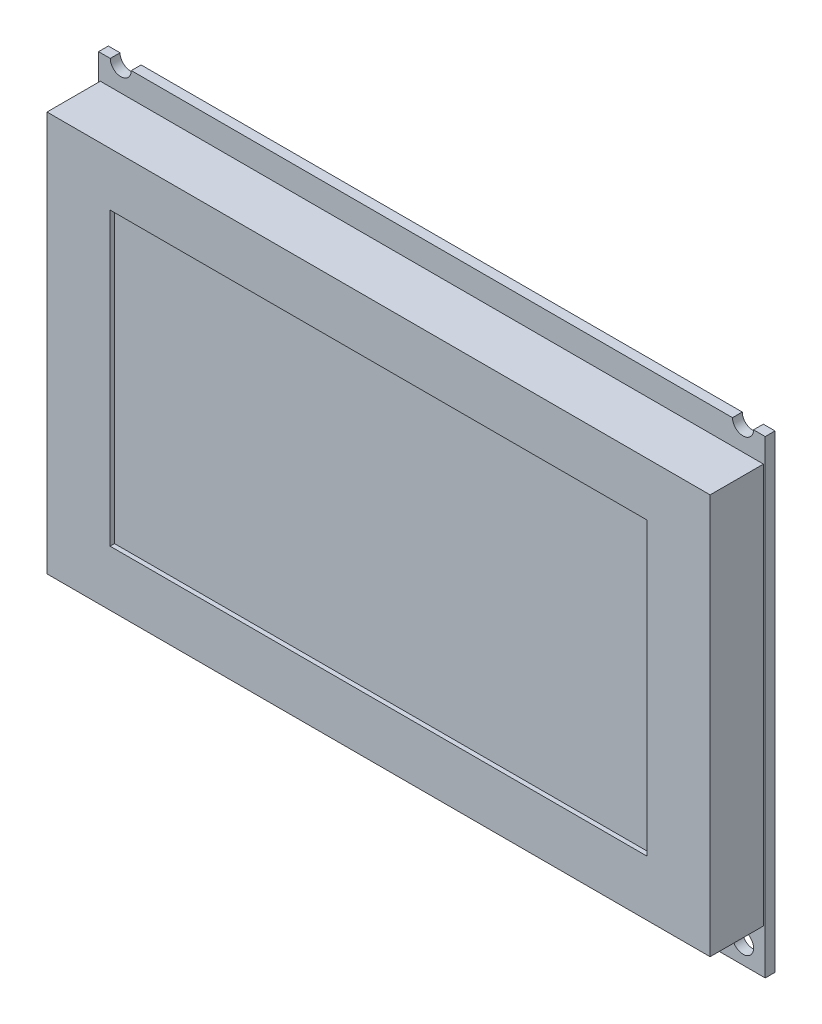
ISO-10303-21;
HEADER;
FILE_DESCRIPTION(('STEP AP214'),'2;1');
FILE_NAME('part.step','',(''),(''),'','','');
FILE_SCHEMA(('AUTOMOTIVE_DESIGN { 1 0 10303 214 1 1 1 1 }'));
ENDSEC;
DATA;
#1=APPLICATION_CONTEXT('core data for automotive mechanical design processes');
#2=APPLICATION_PROTOCOL_DEFINITION('international standard','automotive_design',2000,#1);
#3=PRODUCT_CONTEXT('',#1,'mechanical');
#4=PRODUCT('Part','Part','',(#3));
#5=PRODUCT_RELATED_PRODUCT_CATEGORY('part','',(#4));
#6=PRODUCT_DEFINITION_FORMATION('','',#4);
#7=PRODUCT_DEFINITION_CONTEXT('part definition',#1,'design');
#8=PRODUCT_DEFINITION('design','',#6,#7);
#9=PRODUCT_DEFINITION_SHAPE('','',#8);
#10=(LENGTH_UNIT() NAMED_UNIT(*) SI_UNIT(.MILLI.,.METRE.));
#11=(NAMED_UNIT(*) PLANE_ANGLE_UNIT() SI_UNIT($,.RADIAN.));
#12=(NAMED_UNIT(*) SI_UNIT($,.STERADIAN.) SOLID_ANGLE_UNIT());
#13=UNCERTAINTY_MEASURE_WITH_UNIT(LENGTH_MEASURE(1.E-05),#10,'distance_accuracy_value','');
#14=(GEOMETRIC_REPRESENTATION_CONTEXT(3) GLOBAL_UNCERTAINTY_ASSIGNED_CONTEXT((#13)) GLOBAL_UNIT_ASSIGNED_CONTEXT((#10,
#11,#12)) REPRESENTATION_CONTEXT('',''));
#15=CARTESIAN_POINT('',(0.,0.,0.));
#16=DIRECTION('',(0.,0.,1.));
#17=DIRECTION('',(1.,0.,0.));
#18=AXIS2_PLACEMENT_3D('',#15,#16,#17);
#19=CARTESIAN_POINT('',(0.,0.,1.1));
#20=DIRECTION('',(0.,0.,1.));
#21=DIRECTION('',(1.,0.,0.));
#22=AXIS2_PLACEMENT_3D('',#19,#20,#21);
#23=PLANE('',#22);
#24=CARTESIAN_POINT('',(-35.,-24.125,1.1));
#25=DIRECTION('',(0.,0.,1.));
#26=DIRECTION('',(1.,0.,0.));
#27=AXIS2_PLACEMENT_3D('',#24,#25,#26);
#28=CIRCLE('',#27,1.185);
#29=CARTESIAN_POINT('',(-33.815,-24.125,1.1));
#30=VERTEX_POINT('',#29);
#31=EDGE_CURVE('E234',#30,#30,#28,.T.);
#32=ORIENTED_EDGE('',*,*,#31,.F.);
#33=EDGE_LOOP('',(#32));
#34=FACE_BOUND('',#33,.T.);
#35=CARTESIAN_POINT('',(35.,-24.125,1.1));
#36=DIRECTION('',(0.,0.,1.));
#37=DIRECTION('',(1.,0.,0.));
#38=AXIS2_PLACEMENT_3D('',#35,#36,#37);
#39=CIRCLE('',#38,1.185);
#40=CARTESIAN_POINT('',(36.185,-24.125,1.1));
#41=VERTEX_POINT('',#40);
#42=EDGE_CURVE('E230',#41,#41,#39,.T.);
#43=ORIENTED_EDGE('',*,*,#42,.F.);
#44=EDGE_LOOP('',(#43));
#45=FACE_BOUND('',#44,.T.);
#46=CARTESIAN_POINT('',(-35.,26.375,1.1));
#47=DIRECTION('',(0.,0.,1.));
#48=DIRECTION('',(1.,0.,0.));
#49=AXIS2_PLACEMENT_3D('',#46,#47,#48);
#50=CIRCLE('',#49,1.185);
#51=CARTESIAN_POINT('',(-36.185,26.375,1.1));
#52=VERTEX_POINT('',#51);
#53=CARTESIAN_POINT('',(-33.815,26.375,1.1));
#54=VERTEX_POINT('',#53);
#55=EDGE_CURVE('E214',#52,#54,#50,.T.);
#56=ORIENTED_EDGE('',*,*,#55,.F.);
#57=DIRECTION('',(-1.,0.,0.));
#58=VECTOR('',#57,1.);
#59=CARTESIAN_POINT('',(-37.5,26.375,1.1));
#60=LINE('',#59,#58);
#61=CARTESIAN_POINT('',(-37.5,26.375,1.1));
#62=VERTEX_POINT('',#61);
#63=EDGE_CURVE('E246',#52,#62,#60,.T.);
#64=ORIENTED_EDGE('',*,*,#63,.T.);
#65=DIRECTION('',(0.,-1.,0.));
#66=VECTOR('',#65,1.);
#67=CARTESIAN_POINT('',(-37.5,26.375,1.1));
#68=LINE('',#67,#66);
#69=CARTESIAN_POINT('',(-37.5,-26.375,1.1));
#70=VERTEX_POINT('',#69);
#71=EDGE_CURVE('E251',#62,#70,#68,.T.);
#72=ORIENTED_EDGE('',*,*,#71,.T.);
#73=DIRECTION('',(1.,0.,0.));
#74=VECTOR('',#73,1.);
#75=CARTESIAN_POINT('',(-37.5,-26.375,1.1));
#76=LINE('',#75,#74);
#77=CARTESIAN_POINT('',(37.5,-26.375,1.1));
#78=VERTEX_POINT('',#77);
#79=EDGE_CURVE('E254',#70,#78,#76,.T.);
#80=ORIENTED_EDGE('',*,*,#79,.T.);
#81=DIRECTION('',(0.,1.,0.));
#82=VECTOR('',#81,1.);
#83=CARTESIAN_POINT('',(37.5,26.375,1.1));
#84=LINE('',#83,#82);
#85=CARTESIAN_POINT('',(37.5,26.375,1.1));
#86=VERTEX_POINT('',#85);
#87=EDGE_CURVE('E243',#78,#86,#84,.T.);
#88=ORIENTED_EDGE('',*,*,#87,.T.);
#89=CARTESIAN_POINT('',(36.185,26.375,1.1));
#90=VERTEX_POINT('',#89);
#91=EDGE_CURVE('E248',#86,#90,#60,.T.);
#92=ORIENTED_EDGE('',*,*,#91,.T.);
#93=CARTESIAN_POINT('',(35.,26.375,1.1));
#94=DIRECTION('',(0.,0.,1.));
#95=DIRECTION('',(1.,0.,0.));
#96=AXIS2_PLACEMENT_3D('',#93,#94,#95);
#97=CIRCLE('',#96,1.185);
#98=CARTESIAN_POINT('',(33.815,26.375,1.1));
#99=VERTEX_POINT('',#98);
#100=EDGE_CURVE('E222',#99,#90,#97,.T.);
#101=ORIENTED_EDGE('',*,*,#100,.F.);
#102=EDGE_CURVE('E252',#99,#54,#60,.T.);
#103=ORIENTED_EDGE('',*,*,#102,.T.);
#104=EDGE_LOOP('',(#56,#64,#72,#80,#88,#92,#101,#103));
#105=FACE_BOUND('',#104,.T.);
#106=DIRECTION('',(-1.,0.,0.));
#107=VECTOR('',#106,1.);
#108=CARTESIAN_POINT('',(-37.3,23.595,1.1));
#109=LINE('',#108,#107);
#110=CARTESIAN_POINT('',(37.3,23.595,1.1));
#111=VERTEX_POINT('',#110);
#112=CARTESIAN_POINT('',(-37.3,23.595,1.1));
#113=VERTEX_POINT('',#112);
#114=EDGE_CURVE('E201',#111,#113,#109,.T.);
#115=ORIENTED_EDGE('',*,*,#114,.F.);
#116=DIRECTION('',(0.,1.,0.));
#117=VECTOR('',#116,1.);
#118=CARTESIAN_POINT('',(37.3,23.595,1.1));
#119=LINE('',#118,#117);
#120=CARTESIAN_POINT('',(37.3,-21.405,1.1));
#121=VERTEX_POINT('',#120);
#122=EDGE_CURVE('E184',#121,#111,#119,.T.);
#123=ORIENTED_EDGE('',*,*,#122,.F.);
#124=DIRECTION('',(1.,0.,0.));
#125=VECTOR('',#124,1.);
#126=CARTESIAN_POINT('',(-37.3,-21.405,1.1));
#127=LINE('',#126,#125);
#128=CARTESIAN_POINT('',(-37.3,-21.405,1.1));
#129=VERTEX_POINT('',#128);
#130=EDGE_CURVE('E192',#129,#121,#127,.T.);
#131=ORIENTED_EDGE('',*,*,#130,.F.);
#132=DIRECTION('',(0.,-1.,0.));
#133=VECTOR('',#132,1.);
#134=CARTESIAN_POINT('',(-37.3,23.595,1.1));
#135=LINE('',#134,#133);
#136=EDGE_CURVE('E203',#113,#129,#135,.T.);
#137=ORIENTED_EDGE('',*,*,#136,.F.);
#138=EDGE_LOOP('',(#115,#123,#131,#137));
#139=FACE_BOUND('',#138,.T.);
#140=ADVANCED_FACE('F35',(#34,#45,#105,#139),#23,.T.);
#141=CARTESIAN_POINT('',(-37.5,26.375,1.1));
#142=DIRECTION('',(0.,-1.,0.));
#143=DIRECTION('',(0.,0.,-1.));
#144=AXIS2_PLACEMENT_3D('',#141,#142,#143);
#145=PLANE('',#144);
#146=DIRECTION('',(-1.,0.,0.));
#147=VECTOR('',#146,1.);
#148=CARTESIAN_POINT('',(-37.5,26.375,0.));
#149=LINE('',#148,#147);
#150=CARTESIAN_POINT('',(33.815,26.375,0.));
#151=VERTEX_POINT('',#150);
#152=CARTESIAN_POINT('',(-33.815,26.375,0.));
#153=VERTEX_POINT('',#152);
#154=EDGE_CURVE('E264',#151,#153,#149,.T.);
#155=ORIENTED_EDGE('',*,*,#154,.T.);
#156=DIRECTION('',(0.,0.,1.));
#157=VECTOR('',#156,1.);
#158=CARTESIAN_POINT('',(-33.815,26.375,0.));
#159=LINE('',#158,#157);
#160=EDGE_CURVE('E219',#153,#54,#159,.T.);
#161=ORIENTED_EDGE('',*,*,#160,.T.);
#162=ORIENTED_EDGE('',*,*,#102,.F.);
#163=DIRECTION('',(0.,0.,1.));
#164=VECTOR('',#163,1.);
#165=CARTESIAN_POINT('',(33.815,26.375,0.));
#166=LINE('',#165,#164);
#167=EDGE_CURVE('E224',#99,#151,#166,.F.);
#168=ORIENTED_EDGE('',*,*,#167,.T.);
#169=EDGE_LOOP('',(#155,#161,#162,#168));
#170=FACE_BOUND('',#169,.T.);
#171=ADVANCED_FACE('F305',(#170),#145,.F.);
#172=CARTESIAN_POINT('',(37.5,26.375,0.));
#173=VERTEX_POINT('',#172);
#174=CARTESIAN_POINT('',(36.185,26.375,0.));
#175=VERTEX_POINT('',#174);
#176=EDGE_CURVE('E260',#173,#175,#149,.T.);
#177=ORIENTED_EDGE('',*,*,#176,.T.);
#178=DIRECTION('',(0.,0.,1.));
#179=VECTOR('',#178,1.);
#180=CARTESIAN_POINT('',(36.185,26.375,0.));
#181=LINE('',#180,#179);
#182=EDGE_CURVE('E227',#175,#90,#181,.T.);
#183=ORIENTED_EDGE('',*,*,#182,.T.);
#184=ORIENTED_EDGE('',*,*,#91,.F.);
#185=DIRECTION('',(0.,0.,-1.));
#186=VECTOR('',#185,1.);
#187=CARTESIAN_POINT('',(37.5,26.375,1.1));
#188=LINE('',#187,#186);
#189=EDGE_CURVE('E275',#86,#173,#188,.T.);
#190=ORIENTED_EDGE('',*,*,#189,.T.);
#191=EDGE_LOOP('',(#177,#183,#184,#190));
#192=FACE_BOUND('',#191,.T.);
#193=ADVANCED_FACE('F286',(#192),#145,.F.);
#194=CARTESIAN_POINT('',(37.5,26.375,1.1));
#195=DIRECTION('',(-1.,0.,0.));
#196=DIRECTION('',(0.,-1.,0.));
#197=AXIS2_PLACEMENT_3D('',#194,#195,#196);
#198=PLANE('',#197);
#199=DIRECTION('',(0.,1.,0.));
#200=VECTOR('',#199,1.);
#201=CARTESIAN_POINT('',(37.5,26.375,0.));
#202=LINE('',#201,#200);
#203=CARTESIAN_POINT('',(37.5,-26.375,0.));
#204=VERTEX_POINT('',#203);
#205=EDGE_CURVE('E240',#204,#173,#202,.T.);
#206=ORIENTED_EDGE('',*,*,#205,.T.);
#207=ORIENTED_EDGE('',*,*,#189,.F.);
#208=ORIENTED_EDGE('',*,*,#87,.F.);
#209=DIRECTION('',(0.,0.,-1.));
#210=VECTOR('',#209,1.);
#211=CARTESIAN_POINT('',(37.5,-26.375,1.1));
#212=LINE('',#211,#210);
#213=EDGE_CURVE('E256',#78,#204,#212,.T.);
#214=ORIENTED_EDGE('',*,*,#213,.T.);
#215=EDGE_LOOP('',(#206,#207,#208,#214));
#216=FACE_BOUND('',#215,.T.);
#217=ADVANCED_FACE('F37',(#216),#198,.F.);
#218=ORIENTED_EDGE('',*,*,#63,.F.);
#219=DIRECTION('',(0.,0.,1.));
#220=VECTOR('',#219,1.);
#221=CARTESIAN_POINT('',(-36.185,26.375,0.));
#222=LINE('',#221,#220);
#223=CARTESIAN_POINT('',(-36.185,26.375,0.));
#224=VERTEX_POINT('',#223);
#225=EDGE_CURVE('E216',#52,#224,#222,.F.);
#226=ORIENTED_EDGE('',*,*,#225,.T.);
#227=CARTESIAN_POINT('',(-37.5,26.375,0.));
#228=VERTEX_POINT('',#227);
#229=EDGE_CURVE('E259',#224,#228,#149,.T.);
#230=ORIENTED_EDGE('',*,*,#229,.T.);
#231=DIRECTION('',(0.,0.,-1.));
#232=VECTOR('',#231,1.);
#233=CARTESIAN_POINT('',(-37.5,26.375,1.1));
#234=LINE('',#233,#232);
#235=EDGE_CURVE('E272',#62,#228,#234,.T.);
#236=ORIENTED_EDGE('',*,*,#235,.F.);
#237=EDGE_LOOP('',(#218,#226,#230,#236));
#238=FACE_BOUND('',#237,.T.);
#239=ADVANCED_FACE('F303',(#238),#145,.F.);
#240=CARTESIAN_POINT('',(-37.5,26.375,1.1));
#241=DIRECTION('',(1.,0.,0.));
#242=DIRECTION('',(0.,1.,0.));
#243=AXIS2_PLACEMENT_3D('',#240,#241,#242);
#244=PLANE('',#243);
#245=DIRECTION('',(0.,-1.,0.));
#246=VECTOR('',#245,1.);
#247=CARTESIAN_POINT('',(-37.5,26.375,0.));
#248=LINE('',#247,#246);
#249=CARTESIAN_POINT('',(-37.5,-26.375,0.));
#250=VERTEX_POINT('',#249);
#251=EDGE_CURVE('E263',#228,#250,#248,.T.);
#252=ORIENTED_EDGE('',*,*,#251,.T.);
#253=DIRECTION('',(0.,0.,-1.));
#254=VECTOR('',#253,1.);
#255=CARTESIAN_POINT('',(-37.5,-26.375,1.1));
#256=LINE('',#255,#254);
#257=EDGE_CURVE('E269',#70,#250,#256,.T.);
#258=ORIENTED_EDGE('',*,*,#257,.F.);
#259=ORIENTED_EDGE('',*,*,#71,.F.);
#260=ORIENTED_EDGE('',*,*,#235,.T.);
#261=EDGE_LOOP('',(#252,#258,#259,#260));
#262=FACE_BOUND('',#261,.T.);
#263=ADVANCED_FACE('F299',(#262),#244,.F.);
#264=CARTESIAN_POINT('',(-37.5,-26.375,1.1));
#265=DIRECTION('',(0.,1.,0.));
#266=DIRECTION('',(0.,0.,1.));
#267=AXIS2_PLACEMENT_3D('',#264,#265,#266);
#268=PLANE('',#267);
#269=DIRECTION('',(1.,0.,0.));
#270=VECTOR('',#269,1.);
#271=CARTESIAN_POINT('',(-37.5,-26.375,0.));
#272=LINE('',#271,#270);
#273=EDGE_CURVE('E247',#250,#204,#272,.T.);
#274=ORIENTED_EDGE('',*,*,#273,.T.);
#275=ORIENTED_EDGE('',*,*,#213,.F.);
#276=ORIENTED_EDGE('',*,*,#79,.F.);
#277=ORIENTED_EDGE('',*,*,#257,.T.);
#278=EDGE_LOOP('',(#274,#275,#276,#277));
#279=FACE_BOUND('',#278,.T.);
#280=ADVANCED_FACE('F294',(#279),#268,.F.);
#281=CARTESIAN_POINT('',(0.,0.,0.));
#282=DIRECTION('',(0.,0.,1.));
#283=DIRECTION('',(1.,0.,0.));
#284=AXIS2_PLACEMENT_3D('',#281,#282,#283);
#285=PLANE('',#284);
#286=CARTESIAN_POINT('',(35.,-24.125,0.));
#287=DIRECTION('',(0.,0.,1.));
#288=DIRECTION('',(1.,0.,0.));
#289=AXIS2_PLACEMENT_3D('',#286,#287,#288);
#290=CIRCLE('',#289,1.185);
#291=CARTESIAN_POINT('',(36.185,-24.125,0.));
#292=VERTEX_POINT('',#291);
#293=EDGE_CURVE('E231',#292,#292,#290,.T.);
#294=ORIENTED_EDGE('',*,*,#293,.T.);
#295=EDGE_LOOP('',(#294));
#296=FACE_BOUND('',#295,.T.);
#297=CARTESIAN_POINT('',(-35.,-24.125,0.));
#298=DIRECTION('',(0.,0.,1.));
#299=DIRECTION('',(1.,0.,0.));
#300=AXIS2_PLACEMENT_3D('',#297,#298,#299);
#301=CIRCLE('',#300,1.185);
#302=CARTESIAN_POINT('',(-33.815,-24.125,0.));
#303=VERTEX_POINT('',#302);
#304=EDGE_CURVE('E237',#303,#303,#301,.T.);
#305=ORIENTED_EDGE('',*,*,#304,.T.);
#306=EDGE_LOOP('',(#305));
#307=FACE_BOUND('',#306,.T.);
#308=ORIENTED_EDGE('',*,*,#229,.F.);
#309=CARTESIAN_POINT('',(-35.,26.375,0.));
#310=DIRECTION('',(0.,0.,1.));
#311=DIRECTION('',(1.,0.,0.));
#312=AXIS2_PLACEMENT_3D('',#309,#310,#311);
#313=CIRCLE('',#312,1.185);
#314=EDGE_CURVE('E11',#224,#153,#313,.T.);
#315=ORIENTED_EDGE('',*,*,#314,.T.);
#316=ORIENTED_EDGE('',*,*,#154,.F.);
#317=CARTESIAN_POINT('',(35.,26.375,0.));
#318=DIRECTION('',(0.,0.,1.));
#319=DIRECTION('',(1.,0.,0.));
#320=AXIS2_PLACEMENT_3D('',#317,#318,#319);
#321=CIRCLE('',#320,1.185);
#322=EDGE_CURVE('E43',#151,#175,#321,.T.);
#323=ORIENTED_EDGE('',*,*,#322,.T.);
#324=ORIENTED_EDGE('',*,*,#176,.F.);
#325=ORIENTED_EDGE('',*,*,#205,.F.);
#326=ORIENTED_EDGE('',*,*,#273,.F.);
#327=ORIENTED_EDGE('',*,*,#251,.F.);
#328=EDGE_LOOP('',(#308,#315,#316,#323,#324,#325,#326,#327));
#329=FACE_BOUND('',#328,.T.);
#330=ADVANCED_FACE('F281',(#296,#307,#329),#285,.F.);
#331=CARTESIAN_POINT('',(-35.,-24.125,0.));
#332=DIRECTION('',(0.,0.,1.));
#333=DIRECTION('',(1.,0.,0.));
#334=AXIS2_PLACEMENT_3D('',#331,#332,#333);
#335=CYLINDRICAL_SURFACE('',#334,1.185);
#336=ORIENTED_EDGE('',*,*,#304,.F.);
#337=EDGE_LOOP('',(#336));
#338=FACE_BOUND('',#337,.T.);
#339=ORIENTED_EDGE('',*,*,#31,.T.);
#340=EDGE_LOOP('',(#339));
#341=FACE_BOUND('',#340,.T.);
#342=ADVANCED_FACE('F337',(#338,#341),#335,.F.);
#343=CARTESIAN_POINT('',(35.,-24.125,0.));
#344=DIRECTION('',(0.,0.,1.));
#345=DIRECTION('',(1.,0.,0.));
#346=AXIS2_PLACEMENT_3D('',#343,#344,#345);
#347=CYLINDRICAL_SURFACE('',#346,1.185);
#348=ORIENTED_EDGE('',*,*,#293,.F.);
#349=EDGE_LOOP('',(#348));
#350=FACE_BOUND('',#349,.T.);
#351=ORIENTED_EDGE('',*,*,#42,.T.);
#352=EDGE_LOOP('',(#351));
#353=FACE_BOUND('',#352,.T.);
#354=ADVANCED_FACE('F325',(#350,#353),#347,.F.);
#355=CARTESIAN_POINT('',(35.,26.375,0.));
#356=DIRECTION('',(0.,0.,1.));
#357=DIRECTION('',(1.,0.,0.));
#358=AXIS2_PLACEMENT_3D('',#355,#356,#357);
#359=CYLINDRICAL_SURFACE('',#358,1.185);
#360=ORIENTED_EDGE('',*,*,#322,.F.);
#361=ORIENTED_EDGE('',*,*,#167,.F.);
#362=ORIENTED_EDGE('',*,*,#100,.T.);
#363=ORIENTED_EDGE('',*,*,#182,.F.);
#364=EDGE_LOOP('',(#360,#361,#362,#363));
#365=FACE_BOUND('',#364,.T.);
#366=ADVANCED_FACE('F309',(#365),#359,.F.);
#367=CARTESIAN_POINT('',(-35.,26.375,0.));
#368=DIRECTION('',(0.,0.,1.));
#369=DIRECTION('',(1.,0.,0.));
#370=AXIS2_PLACEMENT_3D('',#367,#368,#369);
#371=CYLINDRICAL_SURFACE('',#370,1.185);
#372=ORIENTED_EDGE('',*,*,#314,.F.);
#373=ORIENTED_EDGE('',*,*,#225,.F.);
#374=ORIENTED_EDGE('',*,*,#55,.T.);
#375=ORIENTED_EDGE('',*,*,#160,.F.);
#376=EDGE_LOOP('',(#372,#373,#374,#375));
#377=FACE_BOUND('',#376,.T.);
#378=ADVANCED_FACE('F314',(#377),#371,.F.);
#379=CARTESIAN_POINT('',(37.3,23.595,7.1));
#380=DIRECTION('',(-1.,0.,0.));
#381=DIRECTION('',(0.,-1.,0.));
#382=AXIS2_PLACEMENT_3D('',#379,#380,#381);
#383=PLANE('',#382);
#384=ORIENTED_EDGE('',*,*,#122,.T.);
#385=DIRECTION('',(0.,0.,-1.));
#386=VECTOR('',#385,1.);
#387=CARTESIAN_POINT('',(37.3,23.595,7.1));
#388=LINE('',#387,#386);
#389=CARTESIAN_POINT('',(37.3,23.595,7.1));
#390=VERTEX_POINT('',#389);
#391=EDGE_CURVE('E212',#390,#111,#388,.T.);
#392=ORIENTED_EDGE('',*,*,#391,.F.);
#393=DIRECTION('',(0.,1.,0.));
#394=VECTOR('',#393,1.);
#395=CARTESIAN_POINT('',(37.3,23.595,7.1));
#396=LINE('',#395,#394);
#397=CARTESIAN_POINT('',(37.3,-21.405,7.1));
#398=VERTEX_POINT('',#397);
#399=EDGE_CURVE('E188',#398,#390,#396,.T.);
#400=ORIENTED_EDGE('',*,*,#399,.F.);
#401=DIRECTION('',(0.,0.,-1.));
#402=VECTOR('',#401,1.);
#403=CARTESIAN_POINT('',(37.3,-21.405,7.1));
#404=LINE('',#403,#402);
#405=EDGE_CURVE('E198',#398,#121,#404,.T.);
#406=ORIENTED_EDGE('',*,*,#405,.T.);
#407=EDGE_LOOP('',(#384,#392,#400,#406));
#408=FACE_BOUND('',#407,.T.);
#409=ADVANCED_FACE('F316',(#408),#383,.F.);
#410=CARTESIAN_POINT('',(-37.3,23.595,7.1));
#411=DIRECTION('',(0.,-1.,0.));
#412=DIRECTION('',(0.,0.,-1.));
#413=AXIS2_PLACEMENT_3D('',#410,#411,#412);
#414=PLANE('',#413);
#415=ORIENTED_EDGE('',*,*,#114,.T.);
#416=DIRECTION('',(0.,0.,-1.));
#417=VECTOR('',#416,1.);
#418=CARTESIAN_POINT('',(-37.3,23.595,7.1));
#419=LINE('',#418,#417);
#420=CARTESIAN_POINT('',(-37.3,23.595,7.1));
#421=VERTEX_POINT('',#420);
#422=EDGE_CURVE('E209',#421,#113,#419,.T.);
#423=ORIENTED_EDGE('',*,*,#422,.F.);
#424=DIRECTION('',(-1.,0.,0.));
#425=VECTOR('',#424,1.);
#426=CARTESIAN_POINT('',(-37.3,23.595,7.1));
#427=LINE('',#426,#425);
#428=EDGE_CURVE('E191',#390,#421,#427,.T.);
#429=ORIENTED_EDGE('',*,*,#428,.F.);
#430=ORIENTED_EDGE('',*,*,#391,.T.);
#431=EDGE_LOOP('',(#415,#423,#429,#430));
#432=FACE_BOUND('',#431,.T.);
#433=ADVANCED_FACE('F322',(#432),#414,.F.);
#434=CARTESIAN_POINT('',(-37.3,23.595,7.1));
#435=DIRECTION('',(1.,0.,0.));
#436=DIRECTION('',(0.,0.,-1.));
#437=AXIS2_PLACEMENT_3D('',#434,#435,#436);
#438=PLANE('',#437);
#439=ORIENTED_EDGE('',*,*,#136,.T.);
#440=DIRECTION('',(0.,0.,-1.));
#441=VECTOR('',#440,1.);
#442=CARTESIAN_POINT('',(-37.3,-21.405,7.1));
#443=LINE('',#442,#441);
#444=CARTESIAN_POINT('',(-37.3,-21.405,7.1));
#445=VERTEX_POINT('',#444);
#446=EDGE_CURVE('E58',#445,#129,#443,.T.);
#447=ORIENTED_EDGE('',*,*,#446,.F.);
#448=DIRECTION('',(0.,-1.,0.));
#449=VECTOR('',#448,1.);
#450=CARTESIAN_POINT('',(-37.3,23.595,7.1));
#451=LINE('',#450,#449);
#452=EDGE_CURVE('E194',#421,#445,#451,.T.);
#453=ORIENTED_EDGE('',*,*,#452,.F.);
#454=ORIENTED_EDGE('',*,*,#422,.T.);
#455=EDGE_LOOP('',(#439,#447,#453,#454));
#456=FACE_BOUND('',#455,.T.);
#457=ADVANCED_FACE('F421',(#456),#438,.F.);
#458=CARTESIAN_POINT('',(-37.3,-21.405,7.1));
#459=DIRECTION('',(0.,1.,0.));
#460=DIRECTION('',(-1.,0.,0.));
#461=AXIS2_PLACEMENT_3D('',#458,#459,#460);
#462=PLANE('',#461);
#463=ORIENTED_EDGE('',*,*,#130,.T.);
#464=ORIENTED_EDGE('',*,*,#405,.F.);
#465=DIRECTION('',(1.,0.,0.));
#466=VECTOR('',#465,1.);
#467=CARTESIAN_POINT('',(-37.3,-21.405,7.1));
#468=LINE('',#467,#466);
#469=EDGE_CURVE('E196',#445,#398,#468,.T.);
#470=ORIENTED_EDGE('',*,*,#469,.F.);
#471=ORIENTED_EDGE('',*,*,#446,.T.);
#472=EDGE_LOOP('',(#463,#464,#470,#471));
#473=FACE_BOUND('',#472,.T.);
#474=ADVANCED_FACE('F430',(#473),#462,.F.);
#475=CARTESIAN_POINT('',(0.,0.,7.1));
#476=DIRECTION('',(0.,0.,1.));
#477=DIRECTION('',(1.,0.,0.));
#478=AXIS2_PLACEMENT_3D('',#475,#476,#477);
#479=PLANE('',#478);
#480=DIRECTION('',(0.,1.,0.));
#481=VECTOR('',#480,1.);
#482=CARTESIAN_POINT('',(30.2,17.595,7.1));
#483=LINE('',#482,#481);
#484=CARTESIAN_POINT('',(30.2,-15.155,7.1));
#485=VERTEX_POINT('',#484);
#486=CARTESIAN_POINT('',(30.2,17.595,7.1));
#487=VERTEX_POINT('',#486);
#488=EDGE_CURVE('E50',#485,#487,#483,.T.);
#489=ORIENTED_EDGE('',*,*,#488,.F.);
#490=DIRECTION('',(1.,0.,0.));
#491=VECTOR('',#490,1.);
#492=CARTESIAN_POINT('',(-30.2,-15.155,7.1));
#493=LINE('',#492,#491);
#494=CARTESIAN_POINT('',(-30.2,-15.155,7.1));
#495=VERTEX_POINT('',#494);
#496=EDGE_CURVE('E169',#495,#485,#493,.T.);
#497=ORIENTED_EDGE('',*,*,#496,.F.);
#498=DIRECTION('',(0.,-1.,0.));
#499=VECTOR('',#498,1.);
#500=CARTESIAN_POINT('',(-30.2,17.595,7.1));
#501=LINE('',#500,#499);
#502=CARTESIAN_POINT('',(-30.2,17.595,7.1));
#503=VERTEX_POINT('',#502);
#504=EDGE_CURVE('E172',#503,#495,#501,.T.);
#505=ORIENTED_EDGE('',*,*,#504,.F.);
#506=DIRECTION('',(-1.,0.,0.));
#507=VECTOR('',#506,1.);
#508=CARTESIAN_POINT('',(-30.2,17.595,7.1));
#509=LINE('',#508,#507);
#510=EDGE_CURVE('E178',#487,#503,#509,.T.);
#511=ORIENTED_EDGE('',*,*,#510,.F.);
#512=EDGE_LOOP('',(#489,#497,#505,#511));
#513=FACE_BOUND('',#512,.T.);
#514=ORIENTED_EDGE('',*,*,#399,.T.);
#515=ORIENTED_EDGE('',*,*,#428,.T.);
#516=ORIENTED_EDGE('',*,*,#452,.T.);
#517=ORIENTED_EDGE('',*,*,#469,.T.);
#518=EDGE_LOOP('',(#514,#515,#516,#517));
#519=FACE_BOUND('',#518,.T.);
#520=ADVANCED_FACE('F439',(#513,#519),#479,.T.);
#521=CARTESIAN_POINT('',(30.2,17.595,6.6));
#522=DIRECTION('',(1.,0.,0.));
#523=DIRECTION('',(0.,0.,-1.));
#524=AXIS2_PLACEMENT_3D('',#521,#522,#523);
#525=PLANE('',#524);
#526=ORIENTED_EDGE('',*,*,#488,.T.);
#527=DIRECTION('',(0.,0.,1.));
#528=VECTOR('',#527,1.);
#529=CARTESIAN_POINT('',(30.2,17.595,6.6));
#530=LINE('',#529,#528);
#531=CARTESIAN_POINT('',(30.2,17.595,6.6));
#532=VERTEX_POINT('',#531);
#533=EDGE_CURVE('E147',#532,#487,#530,.T.);
#534=ORIENTED_EDGE('',*,*,#533,.F.);
#535=DIRECTION('',(0.,1.,0.));
#536=VECTOR('',#535,1.);
#537=CARTESIAN_POINT('',(30.2,17.595,6.6));
#538=LINE('',#537,#536);
#539=CARTESIAN_POINT('',(30.2,-15.155,6.6));
#540=VERTEX_POINT('',#539);
#541=EDGE_CURVE('E151',#540,#532,#538,.T.);
#542=ORIENTED_EDGE('',*,*,#541,.F.);
#543=DIRECTION('',(0.,0.,1.));
#544=VECTOR('',#543,1.);
#545=CARTESIAN_POINT('',(30.2,-15.155,6.6));
#546=LINE('',#545,#544);
#547=EDGE_CURVE('E182',#540,#485,#546,.T.);
#548=ORIENTED_EDGE('',*,*,#547,.T.);
#549=EDGE_LOOP('',(#526,#534,#542,#548));
#550=FACE_BOUND('',#549,.T.);
#551=ADVANCED_FACE('F149',(#550),#525,.F.);
#552=CARTESIAN_POINT('',(-30.2,-15.155,6.6));
#553=DIRECTION('',(0.,-1.,0.));
#554=DIRECTION('',(0.,0.,-1.));
#555=AXIS2_PLACEMENT_3D('',#552,#553,#554);
#556=PLANE('',#555);
#557=ORIENTED_EDGE('',*,*,#496,.T.);
#558=ORIENTED_EDGE('',*,*,#547,.F.);
#559=DIRECTION('',(1.,0.,0.));
#560=VECTOR('',#559,1.);
#561=CARTESIAN_POINT('',(-30.2,-15.155,6.6));
#562=LINE('',#561,#560);
#563=CARTESIAN_POINT('',(-30.2,-15.155,6.6));
#564=VERTEX_POINT('',#563);
#565=EDGE_CURVE('E157',#564,#540,#562,.T.);
#566=ORIENTED_EDGE('',*,*,#565,.F.);
#567=DIRECTION('',(0.,0.,1.));
#568=VECTOR('',#567,1.);
#569=CARTESIAN_POINT('',(-30.2,-15.155,6.6));
#570=LINE('',#569,#568);
#571=EDGE_CURVE('E185',#564,#495,#570,.T.);
#572=ORIENTED_EDGE('',*,*,#571,.T.);
#573=EDGE_LOOP('',(#557,#558,#566,#572));
#574=FACE_BOUND('',#573,.T.);
#575=ADVANCED_FACE('F455',(#574),#556,.F.);
#576=CARTESIAN_POINT('',(-30.2,17.595,6.6));
#577=DIRECTION('',(-1.,0.,0.));
#578=DIRECTION('',(0.,-1.,0.));
#579=AXIS2_PLACEMENT_3D('',#576,#577,#578);
#580=PLANE('',#579);
#581=ORIENTED_EDGE('',*,*,#504,.T.);
#582=ORIENTED_EDGE('',*,*,#571,.F.);
#583=DIRECTION('',(0.,-1.,0.));
#584=VECTOR('',#583,1.);
#585=CARTESIAN_POINT('',(-30.2,17.595,6.6));
#586=LINE('',#585,#584);
#587=CARTESIAN_POINT('',(-30.2,17.595,6.6));
#588=VERTEX_POINT('',#587);
#589=EDGE_CURVE('E165',#588,#564,#586,.T.);
#590=ORIENTED_EDGE('',*,*,#589,.F.);
#591=DIRECTION('',(0.,0.,1.));
#592=VECTOR('',#591,1.);
#593=CARTESIAN_POINT('',(-30.2,17.595,6.6));
#594=LINE('',#593,#592);
#595=EDGE_CURVE('E156',#588,#503,#594,.T.);
#596=ORIENTED_EDGE('',*,*,#595,.T.);
#597=EDGE_LOOP('',(#581,#582,#590,#596));
#598=FACE_BOUND('',#597,.T.);
#599=ADVANCED_FACE('F463',(#598),#580,.F.);
#600=CARTESIAN_POINT('',(-30.2,17.595,6.6));
#601=DIRECTION('',(0.,1.,0.));
#602=DIRECTION('',(0.,0.,1.));
#603=AXIS2_PLACEMENT_3D('',#600,#601,#602);
#604=PLANE('',#603);
#605=ORIENTED_EDGE('',*,*,#510,.T.);
#606=ORIENTED_EDGE('',*,*,#595,.F.);
#607=DIRECTION('',(-1.,0.,0.));
#608=VECTOR('',#607,1.);
#609=CARTESIAN_POINT('',(-30.2,17.595,6.6));
#610=LINE('',#609,#608);
#611=EDGE_CURVE('E160',#532,#588,#610,.T.);
#612=ORIENTED_EDGE('',*,*,#611,.F.);
#613=ORIENTED_EDGE('',*,*,#533,.T.);
#614=EDGE_LOOP('',(#605,#606,#612,#613));
#615=FACE_BOUND('',#614,.T.);
#616=ADVANCED_FACE('F161',(#615),#604,.F.);
#617=CARTESIAN_POINT('',(0.,0.,6.6));
#618=DIRECTION('',(0.,0.,1.));
#619=DIRECTION('',(1.,0.,0.));
#620=AXIS2_PLACEMENT_3D('',#617,#618,#619);
#621=PLANE('',#620);
#622=ORIENTED_EDGE('',*,*,#541,.T.);
#623=ORIENTED_EDGE('',*,*,#611,.T.);
#624=ORIENTED_EDGE('',*,*,#589,.T.);
#625=ORIENTED_EDGE('',*,*,#565,.T.);
#626=EDGE_LOOP('',(#622,#623,#624,#625));
#627=FACE_BOUND('',#626,.T.);
#628=ADVANCED_FACE('F167',(#627),#621,.T.);
#629=CLOSED_SHELL('',(#140,#171,#193,#217,#239,#263,#280,#330,#342,#354,#366,#378,#409,#433,
#457,#474,#520,#551,#575,#599,#616,#628));
#630=MANIFOLD_SOLID_BREP('B2',#629);
#631=ADVANCED_BREP_SHAPE_REPRESENTATION('',(#18,#630),#14);
#632=SHAPE_DEFINITION_REPRESENTATION(#9,#631);
ENDSEC;
END-ISO-10303-21;
